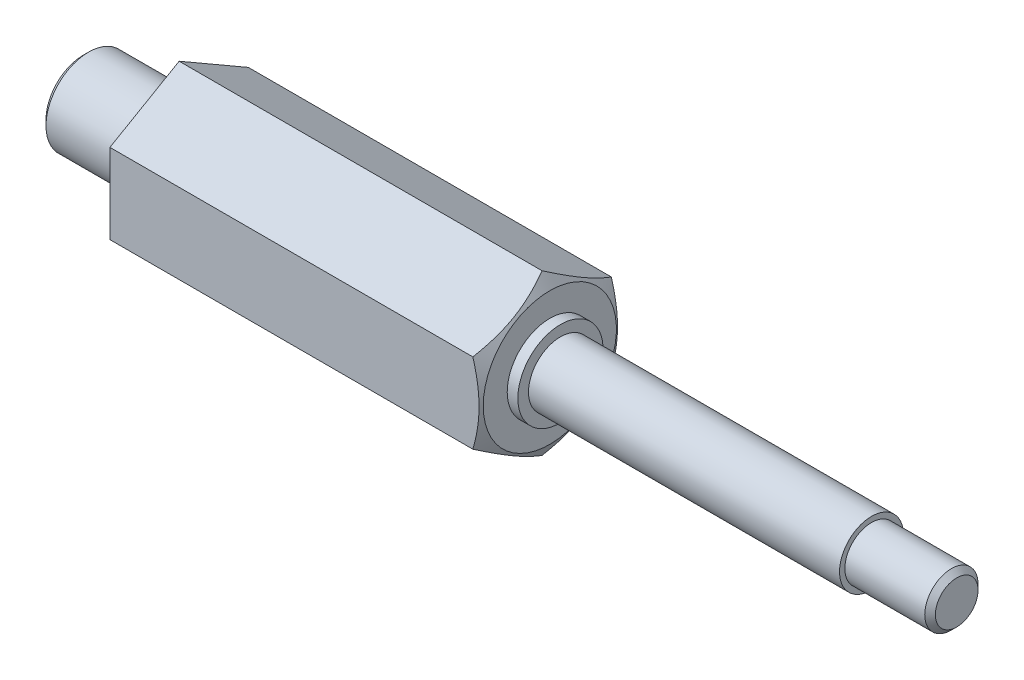
ISO-10303-21;
HEADER;
FILE_DESCRIPTION(('STEP AP214'),'2;1');
FILE_NAME('part.step','',(''),(''),'','','');
FILE_SCHEMA(('AUTOMOTIVE_DESIGN { 1 0 10303 214 1 1 1 1 }'));
ENDSEC;
DATA;
#1=APPLICATION_CONTEXT('core data for automotive mechanical design processes');
#2=APPLICATION_PROTOCOL_DEFINITION('international standard','automotive_design',2000,#1);
#3=PRODUCT_CONTEXT('',#1,'mechanical');
#4=PRODUCT('Part','Part','',(#3));
#5=PRODUCT_RELATED_PRODUCT_CATEGORY('part','',(#4));
#6=PRODUCT_DEFINITION_FORMATION('','',#4);
#7=PRODUCT_DEFINITION_CONTEXT('part definition',#1,'design');
#8=PRODUCT_DEFINITION('design','',#6,#7);
#9=PRODUCT_DEFINITION_SHAPE('','',#8);
#10=(LENGTH_UNIT() NAMED_UNIT(*) SI_UNIT(.MILLI.,.METRE.));
#11=(NAMED_UNIT(*) PLANE_ANGLE_UNIT() SI_UNIT($,.RADIAN.));
#12=(NAMED_UNIT(*) SI_UNIT($,.STERADIAN.) SOLID_ANGLE_UNIT());
#13=UNCERTAINTY_MEASURE_WITH_UNIT(LENGTH_MEASURE(1.E-05),#10,'distance_accuracy_value','');
#14=(GEOMETRIC_REPRESENTATION_CONTEXT(3) GLOBAL_UNCERTAINTY_ASSIGNED_CONTEXT((#13)) GLOBAL_UNIT_ASSIGNED_CONTEXT((#10,
#11,#12)) REPRESENTATION_CONTEXT('',''));
#15=CARTESIAN_POINT('',(0.,0.,0.));
#16=DIRECTION('',(0.,0.,1.));
#17=DIRECTION('',(1.,0.,0.));
#18=AXIS2_PLACEMENT_3D('',#15,#16,#17);
#19=CARTESIAN_POINT('',(34.8,7.50555349946514,0.));
#20=DIRECTION('',(1.,0.,0.));
#21=DIRECTION('',(0.,0.,-1.));
#22=AXIS2_PLACEMENT_3D('',#19,#20,#21);
#23=PLANE('',#22);
#24=CARTESIAN_POINT('',(34.8,0.,0.));
#25=DIRECTION('',(-1.,0.,0.));
#26=DIRECTION('',(0.,0.,1.));
#27=AXIS2_PLACEMENT_3D('',#24,#25,#26);
#28=CIRCLE('',#27,4.);
#29=CARTESIAN_POINT('',(34.8,0.,4.));
#30=VERTEX_POINT('',#29);
#31=EDGE_CURVE('E267',#30,#30,#28,.T.);
#32=ORIENTED_EDGE('',*,*,#31,.T.);
#33=EDGE_LOOP('',(#32));
#34=FACE_BOUND('',#33,.T.);
#35=CARTESIAN_POINT('',(34.8,0.,0.));
#36=DIRECTION('',(-1.,0.,0.));
#37=DIRECTION('',(0.,0.,1.));
#38=AXIS2_PLACEMENT_3D('',#35,#36,#37);
#39=CIRCLE('',#38,6.25);
#40=CARTESIAN_POINT('',(34.8,0.,6.25));
#41=VERTEX_POINT('',#40);
#42=EDGE_CURVE('E194',#41,#41,#39,.T.);
#43=ORIENTED_EDGE('',*,*,#42,.F.);
#44=EDGE_LOOP('',(#43));
#45=FACE_BOUND('',#44,.T.);
#46=ADVANCED_FACE('F36',(#34,#45),#23,.T.);
#47=CARTESIAN_POINT('',(-14.2461728904477,0.,0.));
#48=DIRECTION('',(-1.,0.,0.));
#49=DIRECTION('',(0.,0.,1.));
#50=AXIS2_PLACEMENT_3D('',#47,#48,#49);
#51=CYLINDRICAL_SURFACE('',#50,4.);
#52=CARTESIAN_POINT('',(35.8,0.,0.));
#53=DIRECTION('',(-1.,0.,0.));
#54=DIRECTION('',(0.,0.,1.));
#55=AXIS2_PLACEMENT_3D('',#52,#53,#54);
#56=CIRCLE('',#55,4.);
#57=CARTESIAN_POINT('',(35.8,0.,4.));
#58=VERTEX_POINT('',#57);
#59=EDGE_CURVE('E269',#58,#58,#56,.T.);
#60=ORIENTED_EDGE('',*,*,#59,.T.);
#61=EDGE_LOOP('',(#60));
#62=FACE_BOUND('',#61,.T.);
#63=ORIENTED_EDGE('',*,*,#31,.F.);
#64=EDGE_LOOP('',(#63));
#65=FACE_BOUND('',#64,.T.);
#66=ADVANCED_FACE('F142',(#62,#65),#51,.T.);
#67=CARTESIAN_POINT('',(35.8,4.,0.));
#68=DIRECTION('',(1.,0.,0.));
#69=DIRECTION('',(0.,0.,-1.));
#70=AXIS2_PLACEMENT_3D('',#67,#68,#69);
#71=PLANE('',#70);
#72=CARTESIAN_POINT('',(35.8,0.,0.));
#73=DIRECTION('',(-1.,0.,0.));
#74=DIRECTION('',(0.,0.,1.));
#75=AXIS2_PLACEMENT_3D('',#72,#73,#74);
#76=CIRCLE('',#75,3.);
#77=CARTESIAN_POINT('',(35.8,0.,3.));
#78=VERTEX_POINT('',#77);
#79=EDGE_CURVE('E272',#78,#78,#76,.T.);
#80=ORIENTED_EDGE('',*,*,#79,.T.);
#81=EDGE_LOOP('',(#80));
#82=FACE_BOUND('',#81,.T.);
#83=ORIENTED_EDGE('',*,*,#59,.F.);
#84=EDGE_LOOP('',(#83));
#85=FACE_BOUND('',#84,.T.);
#86=ADVANCED_FACE('F148',(#82,#85),#71,.T.);
#87=CARTESIAN_POINT('',(-14.2461728904477,0.,0.));
#88=DIRECTION('',(-1.,0.,0.));
#89=DIRECTION('',(0.,0.,1.));
#90=AXIS2_PLACEMENT_3D('',#87,#88,#89);
#91=CYLINDRICAL_SURFACE('',#90,3.);
#92=CARTESIAN_POINT('',(65.,0.,0.));
#93=DIRECTION('',(-1.,0.,0.));
#94=DIRECTION('',(0.,0.,1.));
#95=AXIS2_PLACEMENT_3D('',#92,#93,#94);
#96=CIRCLE('',#95,3.);
#97=CARTESIAN_POINT('',(65.,0.,3.));
#98=VERTEX_POINT('',#97);
#99=EDGE_CURVE('E275',#98,#98,#96,.T.);
#100=ORIENTED_EDGE('',*,*,#99,.T.);
#101=EDGE_LOOP('',(#100));
#102=FACE_BOUND('',#101,.T.);
#103=ORIENTED_EDGE('',*,*,#79,.F.);
#104=EDGE_LOOP('',(#103));
#105=FACE_BOUND('',#104,.T.);
#106=ADVANCED_FACE('F288',(#102,#105),#91,.T.);
#107=CARTESIAN_POINT('',(65.,3.,0.));
#108=DIRECTION('',(1.,0.,0.));
#109=DIRECTION('',(0.,0.,-1.));
#110=AXIS2_PLACEMENT_3D('',#107,#108,#109);
#111=PLANE('',#110);
#112=CARTESIAN_POINT('',(65.,0.,0.));
#113=DIRECTION('',(-1.,0.,0.));
#114=DIRECTION('',(0.,0.,1.));
#115=AXIS2_PLACEMENT_3D('',#112,#113,#114);
#116=CIRCLE('',#115,2.5);
#117=CARTESIAN_POINT('',(65.,0.,2.5));
#118=VERTEX_POINT('',#117);
#119=EDGE_CURVE('E233',#118,#118,#116,.T.);
#120=ORIENTED_EDGE('',*,*,#119,.T.);
#121=EDGE_LOOP('',(#120));
#122=FACE_BOUND('',#121,.T.);
#123=ORIENTED_EDGE('',*,*,#99,.F.);
#124=EDGE_LOOP('',(#123));
#125=FACE_BOUND('',#124,.T.);
#126=ADVANCED_FACE('F280',(#122,#125),#111,.T.);
#127=CARTESIAN_POINT('',(-14.2461728904477,0.,0.));
#128=DIRECTION('',(-1.,0.,0.));
#129=DIRECTION('',(0.,0.,1.));
#130=AXIS2_PLACEMENT_3D('',#127,#128,#129);
#131=CYLINDRICAL_SURFACE('',#130,2.5);
#132=CARTESIAN_POINT('',(72.5,0.,0.));
#133=DIRECTION('',(1.,0.,0.));
#134=DIRECTION('',(0.,0.,-1.));
#135=AXIS2_PLACEMENT_3D('',#132,#133,#134);
#136=CIRCLE('',#135,2.5);
#137=CARTESIAN_POINT('',(72.5,0.,-2.5));
#138=VERTEX_POINT('',#137);
#139=EDGE_CURVE('E122',#138,#138,#136,.F.);
#140=ORIENTED_EDGE('',*,*,#139,.T.);
#141=EDGE_LOOP('',(#140));
#142=FACE_BOUND('',#141,.T.);
#143=ORIENTED_EDGE('',*,*,#119,.F.);
#144=EDGE_LOOP('',(#143));
#145=FACE_BOUND('',#144,.T.);
#146=ADVANCED_FACE('F175',(#142,#145),#131,.T.);
#147=CARTESIAN_POINT('',(73.,7.50555349946514,0.));
#148=DIRECTION('',(1.,0.,0.));
#149=DIRECTION('',(0.,0.,-1.));
#150=AXIS2_PLACEMENT_3D('',#147,#148,#149);
#151=PLANE('',#150);
#152=CARTESIAN_POINT('',(73.,0.,0.));
#153=DIRECTION('',(1.,0.,0.));
#154=DIRECTION('',(0.,0.,-1.));
#155=AXIS2_PLACEMENT_3D('',#152,#153,#154);
#156=CIRCLE('',#155,1.99999999999999);
#157=CARTESIAN_POINT('',(73.,0.,-1.99999999999999));
#158=VERTEX_POINT('',#157);
#159=EDGE_CURVE('E125',#158,#158,#156,.T.);
#160=ORIENTED_EDGE('',*,*,#159,.T.);
#161=EDGE_LOOP('',(#160));
#162=FACE_BOUND('',#161,.T.);
#163=ADVANCED_FACE('F172',(#162),#151,.T.);
#164=CARTESIAN_POINT('',(34.0751058491018,0.,0.));
#165=DIRECTION('',(-1.,0.,0.));
#166=DIRECTION('',(0.,0.,1.));
#167=AXIS2_PLACEMENT_3D('',#164,#165,#166);
#168=CONICAL_SURFACE('',#167,7.50555349946514,1.0471975511966);
#169=ORIENTED_EDGE('',*,*,#42,.T.);
#170=EDGE_LOOP('',(#169));
#171=FACE_BOUND('',#170,.T.);
#172=CARTESIAN_POINT('',(34.0750391808967,3.75266127967873,-6.5002));
#173=CARTESIAN_POINT('',(34.1226580096271,3.83515161912751,-6.35732254094112));
#174=CARTESIAN_POINT('',(34.1681157320999,3.91794952254313,-6.21391236546508));
#175=CARTESIAN_POINT('',(34.2541137506796,4.08421773795795,-5.9259273686828));
#176=CARTESIAN_POINT('',(34.2946519254746,4.16768832359106,-5.78135207342873));
#177=CARTESIAN_POINT('',(34.4080914315794,4.41943655294052,-5.34531134947996));
#178=CARTESIAN_POINT('',(34.4726146255739,4.5887079340369,-5.05212471715368));
#179=CARTESIAN_POINT('',(34.5482758491551,4.84201947708215,-4.61337625445563));
#180=CARTESIAN_POINT('',(34.5698295762456,4.92530276780316,-4.46912536350531));
#181=CARTESIAN_POINT('',(34.6059721180965,5.09224566542477,-4.17997178286191));
#182=CARTESIAN_POINT('',(34.6205615482429,5.17590523841628,-4.03506915190111));
#183=CARTESIAN_POINT('',(34.6424036801952,5.34336968579964,-3.74501222057168));
#184=CARTESIAN_POINT('',(34.6496647083805,5.427174286676,-3.59985839394579));
#185=CARTESIAN_POINT('',(34.6567021301204,5.59485627940484,-3.30942466302505));
#186=CARTESIAN_POINT('',(34.6564787548904,5.6787336689286,-3.16414476276364));
#187=CARTESIAN_POINT('',(34.6455789741874,5.90853103021317,-2.76612405757351));
#188=CARTESIAN_POINT('',(34.6272806148332,6.05437578112764,-2.51351353897243));
#189=CARTESIAN_POINT('',(34.5692560912449,6.34509659313135,-2.00997032176432));
#190=CARTESIAN_POINT('',(34.5295100941644,6.48997163178545,-1.75903939406692));
#191=CARTESIAN_POINT('',(34.4301565295004,6.78127752911039,-1.25448277935568));
#192=CARTESIAN_POINT('',(34.3701280070646,6.92767163007068,-1.00092075856409));
#193=CARTESIAN_POINT('',(34.2338874401927,7.21827667013277,-0.497578064240955));
#194=CARTESIAN_POINT('',(34.157707398539,7.36249133098589,-0.247790944447037));
#195=CARTESIAN_POINT('',(34.0750391808967,7.50566896951898,0.000200000000000176));
#196=B_SPLINE_CURVE_WITH_KNOTS('',3,(#172,#173,#174,#175,#176,#177,#178,#179,#180,#181,#182,
#183,#184,#185,#186,#187,#188,#189,#190,#191,#192,#193,#194,#195),.UNSPECIFIED.,.F.,.F.,(4,2,2,
2,2,2,2,2,2,2,2,4),(0.,0.515105052395586,1.03043143507524,2.06322554824262,2.56697389547996,
3.07067772176453,3.57380860368928,4.0769239424252,4.9527935470566,5.82947446853466,
6.72559912449736,7.61996451221045),.UNSPECIFIED.);
#197=CARTESIAN_POINT('',(34.0751058491018,3.75277674973258,-6.5));
#198=VERTEX_POINT('',#197);
#199=CARTESIAN_POINT('',(34.0751058491018,7.50555349946514,0.));
#200=VERTEX_POINT('',#199);
#201=EDGE_CURVE('E94',#198,#200,#196,.T.);
#202=ORIENTED_EDGE('',*,*,#201,.T.);
#203=CARTESIAN_POINT('',(34.0750391808967,7.50566896951897,-0.0002));
#204=CARTESIAN_POINT('',(34.1226580096271,7.4231786300702,0.142677459058881));
#205=CARTESIAN_POINT('',(34.1681157320999,7.34038072665458,0.286087634534914));
#206=CARTESIAN_POINT('',(34.2541137506796,7.17411251123976,0.574072631317196));
#207=CARTESIAN_POINT('',(34.2946519254746,7.09064192560665,0.718647926571265));
#208=CARTESIAN_POINT('',(34.4080914315794,6.83889369625719,1.15468865052003));
#209=CARTESIAN_POINT('',(34.4726146255739,6.66962231516081,1.44787528284632));
#210=CARTESIAN_POINT('',(34.5482758491551,6.41631077211555,1.88662374554437));
#211=CARTESIAN_POINT('',(34.5698295762456,6.33302748139455,2.03087463649469));
#212=CARTESIAN_POINT('',(34.6059721180965,6.16608458377293,2.32002821713809));
#213=CARTESIAN_POINT('',(34.6205615482429,6.08242501078143,2.46493084809889));
#214=CARTESIAN_POINT('',(34.6424036801952,5.91496056339807,2.75498777942832));
#215=CARTESIAN_POINT('',(34.6496647083805,5.8311559625217,2.90014160605421));
#216=CARTESIAN_POINT('',(34.6567021301204,5.66347396979287,3.19057533697495));
#217=CARTESIAN_POINT('',(34.6564787548904,5.5795965802691,3.33585523723636));
#218=CARTESIAN_POINT('',(34.6455789741874,5.34979921898453,3.73387594242649));
#219=CARTESIAN_POINT('',(34.6272806148332,5.20395446807007,3.98648646102757));
#220=CARTESIAN_POINT('',(34.5692560912449,4.91323365606636,4.49002967823568));
#221=CARTESIAN_POINT('',(34.5295100941644,4.76835861741226,4.74096060593308));
#222=CARTESIAN_POINT('',(34.4301565295004,4.47705272008732,5.24551722064432));
#223=CARTESIAN_POINT('',(34.3701280070646,4.33065861912703,5.49907924143591));
#224=CARTESIAN_POINT('',(34.2338874401927,4.04005357906494,6.00242193575904));
#225=CARTESIAN_POINT('',(34.157707398539,3.89583891821182,6.25220905555296));
#226=CARTESIAN_POINT('',(34.0750391808967,3.75266127967873,6.5002));
#227=B_SPLINE_CURVE_WITH_KNOTS('',3,(#203,#204,#205,#206,#207,#208,#209,#210,#211,#212,#213,
#214,#215,#216,#217,#218,#219,#220,#221,#222,#223,#224,#225,#226),.UNSPECIFIED.,.F.,.F.,(4,2,2,
2,2,2,2,2,2,2,2,4),(0.,0.515105052395588,1.03043143507525,2.06322554824262,2.56697389547996,
3.07067772176454,3.57380860368928,4.0769239424252,4.9527935470566,5.82947446853466,
6.72559912449736,7.61996451221045),.UNSPECIFIED.);
#228=CARTESIAN_POINT('',(34.0751058491018,3.75277674973257,6.5));
#229=VERTEX_POINT('',#228);
#230=EDGE_CURVE('E89',#200,#229,#227,.T.);
#231=ORIENTED_EDGE('',*,*,#230,.T.);
#232=CARTESIAN_POINT('',(31.5549066821231,-9.9329111139939,6.5));
#233=CARTESIAN_POINT('',(31.6926631221812,-9.64767955039306,6.5));
#234=CARTESIAN_POINT('',(31.8290440027068,-9.3617713334094,6.5));
#235=CARTESIAN_POINT('',(32.0982681296309,-8.78823564087502,6.5));
#236=CARTESIAN_POINT('',(32.231110758932,-8.50060787599526,6.5));
#237=CARTESIAN_POINT('',(32.49317607593,-7.92170346582779,6.5));
#238=CARTESIAN_POINT('',(32.6223735081559,-7.63041534596978,6.5));
#239=CARTESIAN_POINT('',(32.8751901267429,-7.04543753790205,6.5));
#240=CARTESIAN_POINT('',(32.9988096053565,-6.75174797646854,6.5));
#241=CARTESIAN_POINT('',(33.2404156743668,-6.15794764754984,6.5));
#242=CARTESIAN_POINT('',(33.3583172321106,-5.85780209090144,6.5));
#243=CARTESIAN_POINT('',(33.584836186553,-5.25396342793668,6.5));
#244=CARTESIAN_POINT('',(33.6934525489033,-4.95026993066041,6.5));
#245=CARTESIAN_POINT('',(33.8984682995875,-4.33948377050501,6.5));
#246=CARTESIAN_POINT('',(33.9948938375826,-4.03239997429356,6.5));
#247=CARTESIAN_POINT('',(34.1723823188468,-3.41386453476732,6.5));
#248=CARTESIAN_POINT('',(34.2534501358712,-3.10241431094498,6.5));
#249=CARTESIAN_POINT('',(34.3962809420617,-2.47494029352132,6.5));
#250=CARTESIAN_POINT('',(34.4580377300517,-2.15891506480611,6.5));
#251=CARTESIAN_POINT('',(34.5580556390252,-1.52303274646518,6.5));
#252=CARTESIAN_POINT('',(34.5963167164255,-1.20317564973266,6.5));
#253=CARTESIAN_POINT('',(34.6336334215927,-0.722892860804678,6.5));
#254=CARTESIAN_POINT('',(34.6427290223553,-0.563206443347279,6.5));
#255=CARTESIAN_POINT('',(34.6541557229236,-0.243584804318442,6.5));
#256=CARTESIAN_POINT('',(34.6564869242899,-0.0836495865185579,6.5));
#257=CARTESIAN_POINT('',(34.6543216766309,0.236128769735202,6.5));
#258=CARTESIAN_POINT('',(34.6498271280569,0.395971921427857,6.5));
#259=CARTESIAN_POINT('',(34.6341236583805,0.715330785773323,6.5));
#260=CARTESIAN_POINT('',(34.6229143762201,0.87484648035559,6.5));
#261=CARTESIAN_POINT('',(34.5877932868031,1.26198993509598,6.5));
#262=CARTESIAN_POINT('',(34.5604877807712,1.48931571071904,6.5));
#263=CARTESIAN_POINT('',(34.4937639942984,1.94217299466153,6.5));
#264=CARTESIAN_POINT('',(34.4543438994444,2.16770422901664,6.5));
#265=CARTESIAN_POINT('',(34.3198902081448,2.84200611808104,6.5));
#266=CARTESIAN_POINT('',(34.2087534364401,3.28760230765345,6.5));
#267=CARTESIAN_POINT('',(34.0172887351779,3.95410051775722,6.5));
#268=CARTESIAN_POINT('',(33.9484104300894,4.17848908923234,6.5));
#269=CARTESIAN_POINT('',(33.8038268208105,4.62509856435045,6.5));
#270=CARTESIAN_POINT('',(33.728120903271,4.84731927125519,6.5));
#271=CARTESIAN_POINT('',(33.571501221407,5.28848357156534,6.5));
#272=CARTESIAN_POINT('',(33.4906193076524,5.50743858802282,6.5));
#273=CARTESIAN_POINT('',(33.3241972974301,5.94348794783136,6.5));
#274=CARTESIAN_POINT('',(33.2386588208337,6.16058290820355,6.5));
#275=CARTESIAN_POINT('',(33.1512285322576,6.37689512702088,6.5));
#276=B_SPLINE_CURVE_WITH_KNOTS('',3,(#232,#233,#234,#235,#236,#237,#238,#239,#240,#241,#242,
#243,#244,#245,#246,#247,#248,#249,#250,#251,#252,#253,#254,#255,#256,#257,#258,#259,#260,#261,
#262,#263,#264,#265,#266,#267,#268,#269,#270,#271,#272,#273,#274,#275),.UNSPECIFIED.,.F.,.F.,(4,
2,2,2,2,2,2,2,2,2,2,2,2,2,2,2,2,2,2,2,2,4),(0.,0.950278588424249,1.90072184145585,
2.85663913235111,3.81250628042664,4.77980343869427,5.74720821148916,6.71250133597995,
7.67748761074125,8.64278344534725,9.60808107052473,10.0877950648644,10.5675018567521,
11.0470751113439,11.5266741553803,12.2131633142698,12.8997553394188,14.2755893174374,
14.9797013551423,15.6838767089079,16.3840723670879,17.0840259867149),.UNSPECIFIED.);
#277=CARTESIAN_POINT('',(34.0751058491018,-3.75277674973256,6.50000000000001));
#278=VERTEX_POINT('',#277);
#279=EDGE_CURVE('E92',#229,#278,#276,.F.);
#280=ORIENTED_EDGE('',*,*,#279,.T.);
#281=CARTESIAN_POINT('',(34.0750391808967,-3.75266127967873,6.5002));
#282=CARTESIAN_POINT('',(34.1226580096271,-3.8351516191275,6.35732254094112));
#283=CARTESIAN_POINT('',(34.1681157320999,-3.91794952254312,6.21391236546509));
#284=CARTESIAN_POINT('',(34.2541137506796,-4.08421773795795,5.9259273686828));
#285=CARTESIAN_POINT('',(34.2946519254746,-4.16768832359105,5.78135207342874));
#286=CARTESIAN_POINT('',(34.4080914315794,-4.41943655294051,5.34531134947997));
#287=CARTESIAN_POINT('',(34.4726146255739,-4.5887079340369,5.05212471715368));
#288=CARTESIAN_POINT('',(34.5482758491551,-4.84201947708215,4.61337625445563));
#289=CARTESIAN_POINT('',(34.5698295762456,-4.92530276780316,4.46912536350531));
#290=CARTESIAN_POINT('',(34.6059721180965,-5.09224566542477,4.17997178286191));
#291=CARTESIAN_POINT('',(34.6205615482429,-5.17590523841627,4.03506915190111));
#292=CARTESIAN_POINT('',(34.6424036801953,-5.34336968579964,3.74501222057168));
#293=CARTESIAN_POINT('',(34.6496647083805,-5.427174286676,3.59985839394579));
#294=CARTESIAN_POINT('',(34.6567021301204,-5.59485627940483,3.30942466302505));
#295=CARTESIAN_POINT('',(34.6564787548904,-5.6787336689286,3.16414476276364));
#296=CARTESIAN_POINT('',(34.6455789741874,-5.90853103021317,2.76612405757351));
#297=CARTESIAN_POINT('',(34.6272806148332,-6.05437578112763,2.51351353897243));
#298=CARTESIAN_POINT('',(34.5692560912449,-6.34509659313134,2.00997032176432));
#299=CARTESIAN_POINT('',(34.5295100941644,-6.48997163178544,1.75903939406692));
#300=CARTESIAN_POINT('',(34.4301565295004,-6.78127752911038,1.25448277935568));
#301=CARTESIAN_POINT('',(34.3701280070646,-6.92767163007067,1.00092075856409));
#302=CARTESIAN_POINT('',(34.2338874401927,-7.21827667013277,0.497578064240958));
#303=CARTESIAN_POINT('',(34.157707398539,-7.36249133098589,0.247790944447038));
#304=CARTESIAN_POINT('',(34.0750391808967,-7.50566896951897,-0.000199999999998192));
#305=B_SPLINE_CURVE_WITH_KNOTS('',3,(#281,#282,#283,#284,#285,#286,#287,#288,#289,#290,#291,
#292,#293,#294,#295,#296,#297,#298,#299,#300,#301,#302,#303,#304),.UNSPECIFIED.,.F.,.F.,(4,2,2,
2,2,2,2,2,2,2,2,4),(0.,0.515105052395587,1.03043143507525,2.06322554824262,2.56697389547996,
3.07067772176453,3.57380860368928,4.0769239424252,4.9527935470566,5.82947446853466,
6.72559912449736,7.61996451221045),.UNSPECIFIED.);
#306=CARTESIAN_POINT('',(34.0751058491018,-7.50555349946514,0.));
#307=VERTEX_POINT('',#306);
#308=EDGE_CURVE('E106',#278,#307,#305,.T.);
#309=ORIENTED_EDGE('',*,*,#308,.T.);
#310=CARTESIAN_POINT('',(34.0750391808967,-7.50566896951897,0.000200000000002417));
#311=CARTESIAN_POINT('',(34.1226580096271,-7.4231786300702,-0.142677459058879));
#312=CARTESIAN_POINT('',(34.1681157320999,-7.34038072665458,-0.286087634534911));
#313=CARTESIAN_POINT('',(34.2541137506796,-7.17411251123976,-0.574072631317193));
#314=CARTESIAN_POINT('',(34.2946519254746,-7.09064192560665,-0.718647926571262));
#315=CARTESIAN_POINT('',(34.4080914315794,-6.83889369625719,-1.15468865052003));
#316=CARTESIAN_POINT('',(34.4726146255739,-6.66962231516081,-1.44787528284632));
#317=CARTESIAN_POINT('',(34.5482758491551,-6.41631077211555,-1.88662374554437));
#318=CARTESIAN_POINT('',(34.5698295762456,-6.33302748139454,-2.03087463649469));
#319=CARTESIAN_POINT('',(34.6059721180965,-6.16608458377293,-2.32002821713809));
#320=CARTESIAN_POINT('',(34.6205615482429,-6.08242501078143,-2.46493084809889));
#321=CARTESIAN_POINT('',(34.6424036801953,-5.91496056339807,-2.75498777942832));
#322=CARTESIAN_POINT('',(34.6496647083805,-5.8311559625217,-2.90014160605421));
#323=CARTESIAN_POINT('',(34.6567021301204,-5.66347396979287,-3.19057533697495));
#324=CARTESIAN_POINT('',(34.6564787548904,-5.5795965802691,-3.33585523723636));
#325=CARTESIAN_POINT('',(34.6455789741874,-5.34979921898453,-3.73387594242649));
#326=CARTESIAN_POINT('',(34.6272806148332,-5.20395446807007,-3.98648646102757));
#327=CARTESIAN_POINT('',(34.5692560912449,-4.91323365606636,-4.49002967823568));
#328=CARTESIAN_POINT('',(34.5295100941644,-4.76835861741226,-4.74096060593308));
#329=CARTESIAN_POINT('',(34.4301565295004,-4.47705272008732,-5.24551722064432));
#330=CARTESIAN_POINT('',(34.3701280070646,-4.33065861912703,-5.49907924143591));
#331=CARTESIAN_POINT('',(34.2338874401927,-4.04005357906494,-6.00242193575904));
#332=CARTESIAN_POINT('',(34.157707398539,-3.89583891821182,-6.25220905555296));
#333=CARTESIAN_POINT('',(34.0750391808967,-3.75266127967873,-6.5002));
#334=B_SPLINE_CURVE_WITH_KNOTS('',3,(#310,#311,#312,#313,#314,#315,#316,#317,#318,#319,#320,
#321,#322,#323,#324,#325,#326,#327,#328,#329,#330,#331,#332,#333),.UNSPECIFIED.,.F.,.F.,(4,2,2,
2,2,2,2,2,2,2,2,4),(0.,0.515105052395587,1.03043143507525,2.06322554824262,2.56697389547996,
3.07067772176453,3.57380860368928,4.0769239424252,4.9527935470566,5.82947446853466,
6.72559912449736,7.61996451221045),.UNSPECIFIED.);
#335=CARTESIAN_POINT('',(34.0751058491018,-3.75277674973257,-6.5));
#336=VERTEX_POINT('',#335);
#337=EDGE_CURVE('E51',#307,#336,#334,.T.);
#338=ORIENTED_EDGE('',*,*,#337,.T.);
#339=CARTESIAN_POINT('',(31.5549066821231,-9.9329111139939,-6.5));
#340=CARTESIAN_POINT('',(31.6926631221812,-9.64767955039306,-6.5));
#341=CARTESIAN_POINT('',(31.8290440027068,-9.3617713334094,-6.5));
#342=CARTESIAN_POINT('',(32.0982681296309,-8.78823564087502,-6.5));
#343=CARTESIAN_POINT('',(32.231110758932,-8.50060787599527,-6.5));
#344=CARTESIAN_POINT('',(32.49317607593,-7.9217034658278,-6.5));
#345=CARTESIAN_POINT('',(32.6223735081559,-7.63041534596979,-6.5));
#346=CARTESIAN_POINT('',(32.8751901267429,-7.04543753790206,-6.5));
#347=CARTESIAN_POINT('',(32.9988096053565,-6.75174797646855,-6.5));
#348=CARTESIAN_POINT('',(33.2404156743668,-6.15794764754984,-6.5));
#349=CARTESIAN_POINT('',(33.3583172321106,-5.85780209090144,-6.5));
#350=CARTESIAN_POINT('',(33.584836186553,-5.25396342793668,-6.5));
#351=CARTESIAN_POINT('',(33.6934525489033,-4.95026993066041,-6.5));
#352=CARTESIAN_POINT('',(33.8984682995875,-4.33948377050501,-6.5));
#353=CARTESIAN_POINT('',(33.9948938375826,-4.03239997429357,-6.5));
#354=CARTESIAN_POINT('',(34.1723823188468,-3.41386453476732,-6.5));
#355=CARTESIAN_POINT('',(34.2534501358712,-3.10241431094498,-6.5));
#356=CARTESIAN_POINT('',(34.3962809420617,-2.47494029352132,-6.5));
#357=CARTESIAN_POINT('',(34.4580377300517,-2.15891506480611,-6.5));
#358=CARTESIAN_POINT('',(34.5580556390252,-1.52303274646519,-6.5));
#359=CARTESIAN_POINT('',(34.5963167164255,-1.20317564973266,-6.5));
#360=CARTESIAN_POINT('',(34.6336334215927,-0.72289286080468,-6.5));
#361=CARTESIAN_POINT('',(34.6427290223553,-0.563206443347281,-6.5));
#362=CARTESIAN_POINT('',(34.6541557229236,-0.243584804318444,-6.5));
#363=CARTESIAN_POINT('',(34.6564869242899,-0.0836495865185598,-6.5));
#364=CARTESIAN_POINT('',(34.6543216766309,0.2361287697352,-6.5));
#365=CARTESIAN_POINT('',(34.6498271280569,0.395971921427855,-6.5));
#366=CARTESIAN_POINT('',(34.6341236583805,0.71533078577332,-6.5));
#367=CARTESIAN_POINT('',(34.6229143762201,0.874846480355588,-6.5));
#368=CARTESIAN_POINT('',(34.5877932868031,1.26198993509598,-6.5));
#369=CARTESIAN_POINT('',(34.5604877807712,1.48931571071903,-6.5));
#370=CARTESIAN_POINT('',(34.4937639942984,1.94217299466152,-6.5));
#371=CARTESIAN_POINT('',(34.4543438994444,2.16770422901663,-6.5));
#372=CARTESIAN_POINT('',(34.3198902081448,2.84200611808104,-6.5));
#373=CARTESIAN_POINT('',(34.2087534364401,3.28760230765344,-6.5));
#374=CARTESIAN_POINT('',(34.0172887351779,3.95410051775721,-6.5));
#375=CARTESIAN_POINT('',(33.9484104300894,4.17848908923234,-6.5));
#376=CARTESIAN_POINT('',(33.8038268208105,4.62509856435045,-6.5));
#377=CARTESIAN_POINT('',(33.728120903271,4.84731927125519,-6.5));
#378=CARTESIAN_POINT('',(33.571501221407,5.28848357156534,-6.5));
#379=CARTESIAN_POINT('',(33.4906193076524,5.50743858802281,-6.5));
#380=CARTESIAN_POINT('',(33.3241972974301,5.94348794783136,-6.5));
#381=CARTESIAN_POINT('',(33.2386588208337,6.16058290820355,-6.5));
#382=CARTESIAN_POINT('',(33.1512285322576,6.37689512702088,-6.5));
#383=B_SPLINE_CURVE_WITH_KNOTS('',3,(#339,#340,#341,#342,#343,#344,#345,#346,#347,#348,#349,
#350,#351,#352,#353,#354,#355,#356,#357,#358,#359,#360,#361,#362,#363,#364,#365,#366,#367,#368,
#369,#370,#371,#372,#373,#374,#375,#376,#377,#378,#379,#380,#381,#382),.UNSPECIFIED.,.F.,.F.,(4,
2,2,2,2,2,2,2,2,2,2,2,2,2,2,2,2,2,2,2,2,4),(0.,0.950278588424247,1.90072184145585,
2.8566391323511,3.81250628042664,4.77980343869427,5.74720821148916,6.71250133597995,
7.67748761074125,8.64278344534724,9.60808107052473,10.0877950648644,10.5675018567521,
11.0470751113439,11.5266741553803,12.2131633142698,12.8997553394188,14.2755893174374,
14.9797013551423,15.6838767089079,16.3840723670879,17.0840259867149),.UNSPECIFIED.);
#384=EDGE_CURVE('E187',#336,#198,#383,.T.);
#385=ORIENTED_EDGE('',*,*,#384,.T.);
#386=EDGE_LOOP('',(#202,#231,#280,#309,#338,#385));
#387=FACE_BOUND('',#386,.T.);
#388=ADVANCED_FACE('F91',(#171,#387),#168,.T.);
#389=CARTESIAN_POINT('',(-9.,7.50555349946514,0.));
#390=DIRECTION('',(1.,0.,0.));
#391=DIRECTION('',(0.,0.,-1.));
#392=AXIS2_PLACEMENT_3D('',#389,#390,#391);
#393=PLANE('',#392);
#394=CARTESIAN_POINT('',(-9.,0.,0.));
#395=DIRECTION('',(1.,0.,0.));
#396=DIRECTION('',(0.,0.,-1.));
#397=AXIS2_PLACEMENT_3D('',#394,#395,#396);
#398=CIRCLE('',#397,3.50000000000001);
#399=CARTESIAN_POINT('',(-9.,0.,-3.50000000000001));
#400=VERTEX_POINT('',#399);
#401=EDGE_CURVE('E44',#400,#400,#398,.F.);
#402=ORIENTED_EDGE('',*,*,#401,.T.);
#403=EDGE_LOOP('',(#402));
#404=FACE_BOUND('',#403,.T.);
#405=ADVANCED_FACE('F130',(#404),#393,.F.);
#406=CARTESIAN_POINT('',(-20.132049440141,0.,0.));
#407=DIRECTION('',(-1.,0.,0.));
#408=DIRECTION('',(0.,0.,1.));
#409=AXIS2_PLACEMENT_3D('',#406,#407,#408);
#410=CYLINDRICAL_SURFACE('',#409,4.);
#411=CARTESIAN_POINT('',(-8.50000000000001,0.,0.));
#412=DIRECTION('',(1.,0.,0.));
#413=DIRECTION('',(0.,0.,-1.));
#414=AXIS2_PLACEMENT_3D('',#411,#412,#413);
#415=CIRCLE('',#414,4.);
#416=CARTESIAN_POINT('',(-8.50000000000001,0.,-4.));
#417=VERTEX_POINT('',#416);
#418=EDGE_CURVE('E11',#417,#417,#415,.T.);
#419=ORIENTED_EDGE('',*,*,#418,.T.);
#420=EDGE_LOOP('',(#419));
#421=FACE_BOUND('',#420,.T.);
#422=CARTESIAN_POINT('',(-1.,0.,0.));
#423=DIRECTION('',(-1.,0.,0.));
#424=DIRECTION('',(0.,0.,1.));
#425=AXIS2_PLACEMENT_3D('',#422,#423,#424);
#426=CIRCLE('',#425,4.);
#427=CARTESIAN_POINT('',(-1.,0.,4.));
#428=VERTEX_POINT('',#427);
#429=EDGE_CURVE('E252',#428,#428,#426,.T.);
#430=ORIENTED_EDGE('',*,*,#429,.T.);
#431=EDGE_LOOP('',(#430));
#432=FACE_BOUND('',#431,.T.);
#433=ADVANCED_FACE('F167',(#421,#432),#410,.T.);
#434=CARTESIAN_POINT('',(-1.,4.,0.));
#435=DIRECTION('',(1.,0.,0.));
#436=DIRECTION('',(0.,0.,-1.));
#437=AXIS2_PLACEMENT_3D('',#434,#435,#436);
#438=PLANE('',#437);
#439=CARTESIAN_POINT('',(-1.,0.,0.));
#440=DIRECTION('',(-1.,0.,0.));
#441=DIRECTION('',(0.,0.,1.));
#442=AXIS2_PLACEMENT_3D('',#439,#440,#441);
#443=CIRCLE('',#442,3.45);
#444=CARTESIAN_POINT('',(-1.,0.,3.45));
#445=VERTEX_POINT('',#444);
#446=EDGE_CURVE('E261',#445,#445,#443,.T.);
#447=ORIENTED_EDGE('',*,*,#446,.T.);
#448=EDGE_LOOP('',(#447));
#449=FACE_BOUND('',#448,.T.);
#450=ORIENTED_EDGE('',*,*,#429,.F.);
#451=EDGE_LOOP('',(#450));
#452=FACE_BOUND('',#451,.T.);
#453=ADVANCED_FACE('F163',(#449,#452),#438,.T.);
#454=CARTESIAN_POINT('',(-20.132049440141,0.,0.));
#455=DIRECTION('',(-1.,0.,0.));
#456=DIRECTION('',(0.,0.,1.));
#457=AXIS2_PLACEMENT_3D('',#454,#455,#456);
#458=CYLINDRICAL_SURFACE('',#457,3.45);
#459=CARTESIAN_POINT('',(0.,0.,0.));
#460=DIRECTION('',(-1.,0.,0.));
#461=DIRECTION('',(0.,0.,1.));
#462=AXIS2_PLACEMENT_3D('',#459,#460,#461);
#463=CIRCLE('',#462,3.45);
#464=CARTESIAN_POINT('',(0.,0.,3.45));
#465=VERTEX_POINT('',#464);
#466=EDGE_CURVE('E264',#465,#465,#463,.T.);
#467=ORIENTED_EDGE('',*,*,#466,.T.);
#468=EDGE_LOOP('',(#467));
#469=FACE_BOUND('',#468,.T.);
#470=ORIENTED_EDGE('',*,*,#446,.F.);
#471=EDGE_LOOP('',(#470));
#472=FACE_BOUND('',#471,.T.);
#473=ADVANCED_FACE('F159',(#469,#472),#458,.T.);
#474=CARTESIAN_POINT('',(0.,3.45,0.));
#475=DIRECTION('',(-1.,0.,0.));
#476=DIRECTION('',(0.,0.,1.));
#477=AXIS2_PLACEMENT_3D('',#474,#475,#476);
#478=PLANE('',#477);
#479=ORIENTED_EDGE('',*,*,#466,.F.);
#480=EDGE_LOOP('',(#479));
#481=FACE_BOUND('',#480,.T.);
#482=DIRECTION('',(0.,-0.5,-0.866025403784439));
#483=VECTOR('',#482,1.);
#484=CARTESIAN_POINT('',(0.,3.75277674973257,-6.5));
#485=LINE('',#484,#483);
#486=CARTESIAN_POINT('',(0.,7.50555349946514,0.));
#487=VERTEX_POINT('',#486);
#488=CARTESIAN_POINT('',(0.,3.75277674973257,-6.5));
#489=VERTEX_POINT('',#488);
#490=EDGE_CURVE('E237',#487,#489,#485,.T.);
#491=ORIENTED_EDGE('',*,*,#490,.T.);
#492=DIRECTION('',(0.,-1.,0.));
#493=VECTOR('',#492,1.);
#494=CARTESIAN_POINT('',(0.,-3.75277674973257,-6.5));
#495=LINE('',#494,#493);
#496=CARTESIAN_POINT('',(0.,-3.75277674973257,-6.5));
#497=VERTEX_POINT('',#496);
#498=EDGE_CURVE('E114',#489,#497,#495,.T.);
#499=ORIENTED_EDGE('',*,*,#498,.T.);
#500=DIRECTION('',(0.,-0.5,0.866025403784439));
#501=VECTOR('',#500,1.);
#502=CARTESIAN_POINT('',(0.,-7.50555349946513,0.));
#503=LINE('',#502,#501);
#504=CARTESIAN_POINT('',(0.,-7.50555349946514,0.));
#505=VERTEX_POINT('',#504);
#506=EDGE_CURVE('E246',#497,#505,#503,.T.);
#507=ORIENTED_EDGE('',*,*,#506,.T.);
#508=DIRECTION('',(0.,0.5,0.866025403784438));
#509=VECTOR('',#508,1.);
#510=CARTESIAN_POINT('',(0.,-3.75277674973257,6.5));
#511=LINE('',#510,#509);
#512=CARTESIAN_POINT('',(0.,-3.75277674973257,6.5));
#513=VERTEX_POINT('',#512);
#514=EDGE_CURVE('E251',#505,#513,#511,.T.);
#515=ORIENTED_EDGE('',*,*,#514,.T.);
#516=DIRECTION('',(0.,1.,0.));
#517=VECTOR('',#516,1.);
#518=CARTESIAN_POINT('',(0.,3.75277674973257,6.5));
#519=LINE('',#518,#517);
#520=CARTESIAN_POINT('',(0.,3.75277674973257,6.5));
#521=VERTEX_POINT('',#520);
#522=EDGE_CURVE('E255',#513,#521,#519,.T.);
#523=ORIENTED_EDGE('',*,*,#522,.T.);
#524=DIRECTION('',(0.,0.5,-0.866025403784439));
#525=VECTOR('',#524,1.);
#526=CARTESIAN_POINT('',(0.,7.50555349946514,0.));
#527=LINE('',#526,#525);
#528=EDGE_CURVE('E111',#521,#487,#527,.T.);
#529=ORIENTED_EDGE('',*,*,#528,.T.);
#530=EDGE_LOOP('',(#491,#499,#507,#515,#523,#529));
#531=FACE_BOUND('',#530,.T.);
#532=ADVANCED_FACE('F155',(#481,#531),#478,.T.);
#533=CARTESIAN_POINT('',(73.,-3.75277674973257,-6.5));
#534=DIRECTION('',(0.,0.,1.));
#535=DIRECTION('',(0.,-1.,0.));
#536=AXIS2_PLACEMENT_3D('',#533,#534,#535);
#537=PLANE('',#536);
#538=ORIENTED_EDGE('',*,*,#384,.F.);
#539=DIRECTION('',(-1.,0.,0.));
#540=VECTOR('',#539,1.);
#541=CARTESIAN_POINT('',(73.,-3.75277674973257,-6.5));
#542=LINE('',#541,#540);
#543=EDGE_CURVE('E236',#336,#497,#542,.T.);
#544=ORIENTED_EDGE('',*,*,#543,.T.);
#545=ORIENTED_EDGE('',*,*,#498,.F.);
#546=DIRECTION('',(-1.,0.,0.));
#547=VECTOR('',#546,1.);
#548=CARTESIAN_POINT('',(73.,3.75277674973257,-6.5));
#549=LINE('',#548,#547);
#550=EDGE_CURVE('E59',#198,#489,#549,.T.);
#551=ORIENTED_EDGE('',*,*,#550,.F.);
#552=EDGE_LOOP('',(#538,#544,#545,#551));
#553=FACE_BOUND('',#552,.T.);
#554=ADVANCED_FACE('F158',(#553),#537,.F.);
#555=CARTESIAN_POINT('',(73.,-7.50555349946513,0.));
#556=DIRECTION('',(0.,0.866025403784439,0.5));
#557=DIRECTION('',(0.,-0.5,0.866025403784439));
#558=AXIS2_PLACEMENT_3D('',#555,#556,#557);
#559=PLANE('',#558);
#560=ORIENTED_EDGE('',*,*,#337,.F.);
#561=DIRECTION('',(-1.,0.,0.));
#562=VECTOR('',#561,1.);
#563=CARTESIAN_POINT('',(73.,-7.50555349946513,0.));
#564=LINE('',#563,#562);
#565=EDGE_CURVE('E116',#307,#505,#564,.T.);
#566=ORIENTED_EDGE('',*,*,#565,.T.);
#567=ORIENTED_EDGE('',*,*,#506,.F.);
#568=ORIENTED_EDGE('',*,*,#543,.F.);
#569=EDGE_LOOP('',(#560,#566,#567,#568));
#570=FACE_BOUND('',#569,.T.);
#571=ADVANCED_FACE('F182',(#570),#559,.F.);
#572=CARTESIAN_POINT('',(73.,-3.75277674973257,6.5));
#573=DIRECTION('',(0.,0.866025403784439,-0.5));
#574=DIRECTION('',(0.,0.5,0.866025403784438));
#575=AXIS2_PLACEMENT_3D('',#572,#573,#574);
#576=PLANE('',#575);
#577=ORIENTED_EDGE('',*,*,#308,.F.);
#578=DIRECTION('',(-1.,0.,0.));
#579=VECTOR('',#578,1.);
#580=CARTESIAN_POINT('',(73.,-3.75277674973257,6.5));
#581=LINE('',#580,#579);
#582=EDGE_CURVE('E105',#278,#513,#581,.T.);
#583=ORIENTED_EDGE('',*,*,#582,.T.);
#584=ORIENTED_EDGE('',*,*,#514,.F.);
#585=ORIENTED_EDGE('',*,*,#565,.F.);
#586=EDGE_LOOP('',(#577,#583,#584,#585));
#587=FACE_BOUND('',#586,.T.);
#588=ADVANCED_FACE('F254',(#587),#576,.F.);
#589=CARTESIAN_POINT('',(73.,3.75277674973257,6.5));
#590=DIRECTION('',(0.,0.,-1.));
#591=DIRECTION('',(-1.,0.,0.));
#592=AXIS2_PLACEMENT_3D('',#589,#590,#591);
#593=PLANE('',#592);
#594=ORIENTED_EDGE('',*,*,#279,.F.);
#595=DIRECTION('',(-1.,0.,0.));
#596=VECTOR('',#595,1.);
#597=CARTESIAN_POINT('',(73.,3.75277674973257,6.5));
#598=LINE('',#597,#596);
#599=EDGE_CURVE('E103',#229,#521,#598,.T.);
#600=ORIENTED_EDGE('',*,*,#599,.T.);
#601=ORIENTED_EDGE('',*,*,#522,.F.);
#602=ORIENTED_EDGE('',*,*,#582,.F.);
#603=EDGE_LOOP('',(#594,#600,#601,#602));
#604=FACE_BOUND('',#603,.T.);
#605=ADVANCED_FACE('F101',(#604),#593,.F.);
#606=CARTESIAN_POINT('',(73.,7.50555349946514,0.));
#607=DIRECTION('',(0.,-0.866025403784439,-0.5));
#608=DIRECTION('',(0.,0.5,-0.866025403784439));
#609=AXIS2_PLACEMENT_3D('',#606,#607,#608);
#610=PLANE('',#609);
#611=ORIENTED_EDGE('',*,*,#230,.F.);
#612=DIRECTION('',(-1.,0.,0.));
#613=VECTOR('',#612,1.);
#614=CARTESIAN_POINT('',(73.,7.50555349946514,0.));
#615=LINE('',#614,#613);
#616=EDGE_CURVE('E112',#200,#487,#615,.T.);
#617=ORIENTED_EDGE('',*,*,#616,.T.);
#618=ORIENTED_EDGE('',*,*,#528,.F.);
#619=ORIENTED_EDGE('',*,*,#599,.F.);
#620=EDGE_LOOP('',(#611,#617,#618,#619));
#621=FACE_BOUND('',#620,.T.);
#622=ADVANCED_FACE('F109',(#621),#610,.F.);
#623=CARTESIAN_POINT('',(73.,3.75277674973257,-6.5));
#624=DIRECTION('',(0.,-0.866025403784439,0.5));
#625=DIRECTION('',(0.,-0.5,-0.866025403784439));
#626=AXIS2_PLACEMENT_3D('',#623,#624,#625);
#627=PLANE('',#626);
#628=ORIENTED_EDGE('',*,*,#201,.F.);
#629=ORIENTED_EDGE('',*,*,#550,.T.);
#630=ORIENTED_EDGE('',*,*,#490,.F.);
#631=ORIENTED_EDGE('',*,*,#616,.F.);
#632=EDGE_LOOP('',(#628,#629,#630,#631));
#633=FACE_BOUND('',#632,.T.);
#634=ADVANCED_FACE('F138',(#633),#627,.F.);
#635=CARTESIAN_POINT('',(72.5,0.,0.));
#636=DIRECTION('',(-1.,0.,0.));
#637=DIRECTION('',(0.,0.,1.));
#638=AXIS2_PLACEMENT_3D('',#635,#636,#637);
#639=CONICAL_SURFACE('',#638,2.5,0.785398163397439);
#640=ORIENTED_EDGE('',*,*,#159,.F.);
#641=EDGE_LOOP('',(#640));
#642=FACE_BOUND('',#641,.T.);
#643=ORIENTED_EDGE('',*,*,#139,.F.);
#644=EDGE_LOOP('',(#643));
#645=FACE_BOUND('',#644,.T.);
#646=ADVANCED_FACE('F133',(#642,#645),#639,.T.);
#647=CARTESIAN_POINT('',(-9.,0.,0.));
#648=DIRECTION('',(1.,0.,0.));
#649=DIRECTION('',(0.,0.,-1.));
#650=AXIS2_PLACEMENT_3D('',#647,#648,#649);
#651=CONICAL_SURFACE('',#650,3.50000000000001,0.785398163397445);
#652=ORIENTED_EDGE('',*,*,#418,.F.);
#653=EDGE_LOOP('',(#652));
#654=FACE_BOUND('',#653,.T.);
#655=ORIENTED_EDGE('',*,*,#401,.F.);
#656=EDGE_LOOP('',(#655));
#657=FACE_BOUND('',#656,.T.);
#658=ADVANCED_FACE('F38',(#654,#657),#651,.T.);
#659=CLOSED_SHELL('',(#46,#66,#86,#106,#126,#146,#163,#388,#405,#433,#453,#473,#532,#554,#571,
#588,#605,#622,#634,#646,#658));
#660=MANIFOLD_SOLID_BREP('B2',#659);
#661=ADVANCED_BREP_SHAPE_REPRESENTATION('',(#18,#660),#14);
#662=SHAPE_DEFINITION_REPRESENTATION(#9,#661);
ENDSEC;
END-ISO-10303-21;
